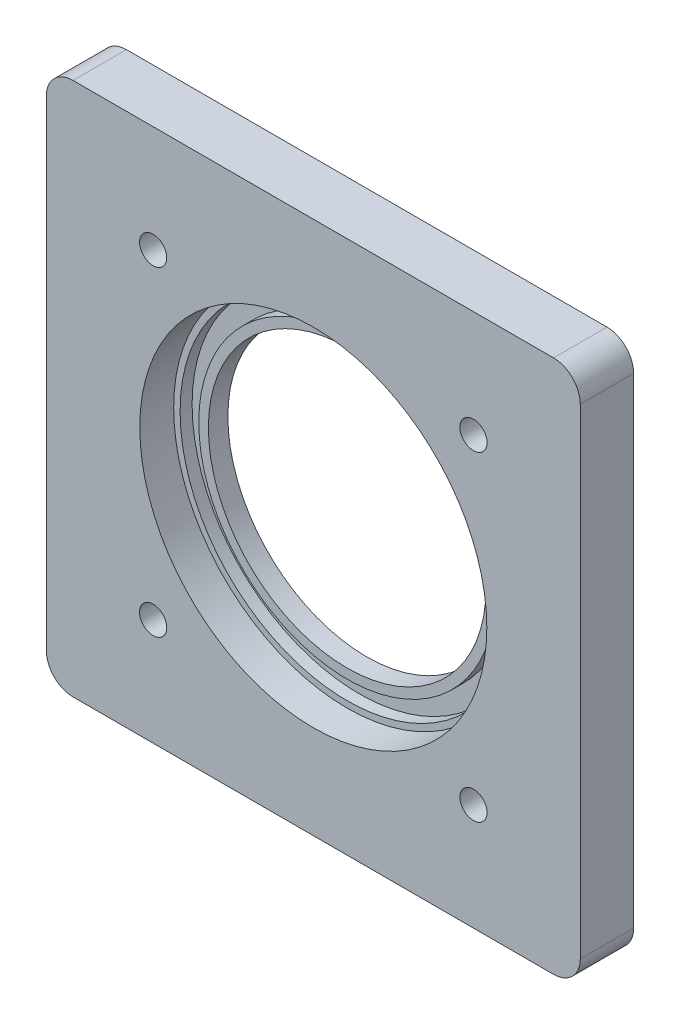
ISO-10303-21;
HEADER;
FILE_DESCRIPTION(('STEP AP214'),'2;1');
FILE_NAME('part.step','',(''),(''),'','','');
FILE_SCHEMA(('AUTOMOTIVE_DESIGN { 1 0 10303 214 1 1 1 1 }'));
ENDSEC;
DATA;
#1=APPLICATION_CONTEXT('core data for automotive mechanical design processes');
#2=APPLICATION_PROTOCOL_DEFINITION('international standard','automotive_design',2000,#1);
#3=PRODUCT_CONTEXT('',#1,'mechanical');
#4=PRODUCT('Part','Part','',(#3));
#5=PRODUCT_RELATED_PRODUCT_CATEGORY('part','',(#4));
#6=PRODUCT_DEFINITION_FORMATION('','',#4);
#7=PRODUCT_DEFINITION_CONTEXT('part definition',#1,'design');
#8=PRODUCT_DEFINITION('design','',#6,#7);
#9=PRODUCT_DEFINITION_SHAPE('','',#8);
#10=(LENGTH_UNIT() NAMED_UNIT(*) SI_UNIT(.MILLI.,.METRE.));
#11=(NAMED_UNIT(*) PLANE_ANGLE_UNIT() SI_UNIT($,.RADIAN.));
#12=(NAMED_UNIT(*) SI_UNIT($,.STERADIAN.) SOLID_ANGLE_UNIT());
#13=UNCERTAINTY_MEASURE_WITH_UNIT(LENGTH_MEASURE(1.E-05),#10,'distance_accuracy_value','');
#14=(GEOMETRIC_REPRESENTATION_CONTEXT(3) GLOBAL_UNCERTAINTY_ASSIGNED_CONTEXT((#13)) GLOBAL_UNIT_ASSIGNED_CONTEXT((#10,
#11,#12)) REPRESENTATION_CONTEXT('',''));
#15=CARTESIAN_POINT('',(0.,0.,0.));
#16=DIRECTION('',(0.,0.,1.));
#17=DIRECTION('',(1.,0.,0.));
#18=AXIS2_PLACEMENT_3D('',#15,#16,#17);
#19=CARTESIAN_POINT('',(50.,50.,1.4));
#20=DIRECTION('',(0.,0.,-1.));
#21=DIRECTION('',(-1.,0.,0.));
#22=AXIS2_PLACEMENT_3D('',#19,#20,#21);
#23=PLANE('',#22);
#24=CARTESIAN_POINT('',(50.,50.,1.4));
#25=DIRECTION('',(0.,0.,-1.));
#26=DIRECTION('',(-1.,0.,0.));
#27=AXIS2_PLACEMENT_3D('',#24,#25,#26);
#28=CIRCLE('',#27,27.8);
#29=CARTESIAN_POINT('',(22.2,50.,1.4));
#30=VERTEX_POINT('',#29);
#31=EDGE_CURVE('E455',#30,#30,#28,.T.);
#32=ORIENTED_EDGE('',*,*,#31,.T.);
#33=EDGE_LOOP('',(#32));
#34=FACE_BOUND('',#33,.T.);
#35=CARTESIAN_POINT('',(50.,50.,1.4));
#36=DIRECTION('',(0.,0.,1.));
#37=DIRECTION('',(1.,0.,0.));
#38=AXIS2_PLACEMENT_3D('',#35,#36,#37);
#39=CIRCLE('',#38,31.3);
#40=CARTESIAN_POINT('',(81.3,50.,1.4));
#41=VERTEX_POINT('',#40);
#42=EDGE_CURVE('E194',#41,#41,#39,.T.);
#43=ORIENTED_EDGE('',*,*,#42,.T.);
#44=EDGE_LOOP('',(#43));
#45=FACE_BOUND('',#44,.T.);
#46=ADVANCED_FACE('F45',(#34,#45),#23,.F.);
#47=CARTESIAN_POINT('',(50.,50.,10.));
#48=DIRECTION('',(0.,0.,1.));
#49=DIRECTION('',(1.,0.,0.));
#50=AXIS2_PLACEMENT_3D('',#47,#48,#49);
#51=CYLINDRICAL_SURFACE('',#50,31.3);
#52=CARTESIAN_POINT('',(50.,50.,3.65));
#53=DIRECTION('',(0.,0.,-1.));
#54=DIRECTION('',(-1.,0.,0.));
#55=AXIS2_PLACEMENT_3D('',#52,#53,#54);
#56=CIRCLE('',#55,31.3);
#57=CARTESIAN_POINT('',(18.7,50.,3.65));
#58=VERTEX_POINT('',#57);
#59=EDGE_CURVE('E462',#58,#58,#56,.T.);
#60=ORIENTED_EDGE('',*,*,#59,.F.);
#61=EDGE_LOOP('',(#60));
#62=FACE_BOUND('',#61,.T.);
#63=ORIENTED_EDGE('',*,*,#42,.F.);
#64=EDGE_LOOP('',(#63));
#65=FACE_BOUND('',#64,.T.);
#66=ADVANCED_FACE('F227',(#62,#65),#51,.F.);
#67=CARTESIAN_POINT('',(50.,50.,3.65));
#68=DIRECTION('',(0.,0.,-1.));
#69=DIRECTION('',(-1.,0.,0.));
#70=AXIS2_PLACEMENT_3D('',#67,#68,#69);
#71=CYLINDRICAL_SURFACE('',#70,27.8);
#72=CARTESIAN_POINT('',(50.,50.,3.65));
#73=DIRECTION('',(0.,0.,-1.));
#74=DIRECTION('',(-1.,0.,0.));
#75=AXIS2_PLACEMENT_3D('',#72,#73,#74);
#76=CIRCLE('',#75,27.8);
#77=CARTESIAN_POINT('',(22.2,50.,3.65));
#78=VERTEX_POINT('',#77);
#79=EDGE_CURVE('E453',#78,#78,#76,.T.);
#80=ORIENTED_EDGE('',*,*,#79,.T.);
#81=EDGE_LOOP('',(#80));
#82=FACE_BOUND('',#81,.T.);
#83=ORIENTED_EDGE('',*,*,#31,.F.);
#84=EDGE_LOOP('',(#83));
#85=FACE_BOUND('',#84,.T.);
#86=ADVANCED_FACE('F234',(#82,#85),#71,.T.);
#87=CARTESIAN_POINT('',(77.8,50.,3.65));
#88=DIRECTION('',(0.,0.,1.));
#89=DIRECTION('',(1.,0.,0.));
#90=AXIS2_PLACEMENT_3D('',#87,#88,#89);
#91=PLANE('',#90);
#92=CARTESIAN_POINT('',(50.,50.,3.65));
#93=DIRECTION('',(0.,0.,1.));
#94=DIRECTION('',(1.,0.,0.));
#95=AXIS2_PLACEMENT_3D('',#92,#93,#94);
#96=CIRCLE('',#95,26.);
#97=CARTESIAN_POINT('',(76.,50.,3.65));
#98=VERTEX_POINT('',#97);
#99=EDGE_CURVE('E508',#98,#98,#96,.T.);
#100=ORIENTED_EDGE('',*,*,#99,.F.);
#101=EDGE_LOOP('',(#100));
#102=FACE_BOUND('',#101,.T.);
#103=ORIENTED_EDGE('',*,*,#79,.F.);
#104=EDGE_LOOP('',(#103));
#105=FACE_BOUND('',#104,.T.);
#106=ADVANCED_FACE('F399',(#102,#105),#91,.T.);
#107=CARTESIAN_POINT('',(50.,50.,10.));
#108=DIRECTION('',(0.,0.,-1.));
#109=DIRECTION('',(-1.,0.,0.));
#110=AXIS2_PLACEMENT_3D('',#107,#108,#109);
#111=CYLINDRICAL_SURFACE('',#110,32.5);
#112=CARTESIAN_POINT('',(50.,50.,10.));
#113=DIRECTION('',(0.,0.,-1.));
#114=DIRECTION('',(-1.,0.,0.));
#115=AXIS2_PLACEMENT_3D('',#112,#113,#114);
#116=CIRCLE('',#115,32.5);
#117=CARTESIAN_POINT('',(17.5,50.,10.));
#118=VERTEX_POINT('',#117);
#119=EDGE_CURVE('E457',#118,#118,#116,.T.);
#120=ORIENTED_EDGE('',*,*,#119,.F.);
#121=EDGE_LOOP('',(#120));
#122=FACE_BOUND('',#121,.T.);
#123=CARTESIAN_POINT('',(50.,50.,3.65));
#124=DIRECTION('',(0.,0.,-1.));
#125=DIRECTION('',(-1.,0.,0.));
#126=AXIS2_PLACEMENT_3D('',#123,#124,#125);
#127=CIRCLE('',#126,32.5);
#128=CARTESIAN_POINT('',(17.5,50.,3.65));
#129=VERTEX_POINT('',#128);
#130=EDGE_CURVE('E468',#129,#129,#127,.T.);
#131=ORIENTED_EDGE('',*,*,#130,.T.);
#132=EDGE_LOOP('',(#131));
#133=FACE_BOUND('',#132,.T.);
#134=ADVANCED_FACE('F389',(#122,#133),#111,.F.);
#135=CARTESIAN_POINT('',(81.3,50.,3.65));
#136=DIRECTION('',(0.,0.,-1.));
#137=DIRECTION('',(-1.,0.,0.));
#138=AXIS2_PLACEMENT_3D('',#135,#136,#137);
#139=PLANE('',#138);
#140=ORIENTED_EDGE('',*,*,#130,.F.);
#141=EDGE_LOOP('',(#140));
#142=FACE_BOUND('',#141,.T.);
#143=ORIENTED_EDGE('',*,*,#59,.T.);
#144=EDGE_LOOP('',(#143));
#145=FACE_BOUND('',#144,.T.);
#146=ADVANCED_FACE('F247',(#142,#145),#139,.F.);
#147=CARTESIAN_POINT('',(0.,0.,0.));
#148=DIRECTION('',(0.,0.,-1.));
#149=DIRECTION('',(-1.,0.,0.));
#150=AXIS2_PLACEMENT_3D('',#147,#148,#149);
#151=PLANE('',#150);
#152=CARTESIAN_POINT('',(50.,50.,0.));
#153=DIRECTION('',(0.,0.,1.));
#154=DIRECTION('',(1.,0.,0.));
#155=AXIS2_PLACEMENT_3D('',#152,#153,#154);
#156=CIRCLE('',#155,26.);
#157=CARTESIAN_POINT('',(76.,50.,0.));
#158=VERTEX_POINT('',#157);
#159=EDGE_CURVE('E504',#158,#158,#156,.T.);
#160=ORIENTED_EDGE('',*,*,#159,.T.);
#161=EDGE_LOOP('',(#160));
#162=FACE_BOUND('',#161,.T.);
#163=DIRECTION('',(-1.,0.,0.));
#164=VECTOR('',#163,1.);
#165=CARTESIAN_POINT('',(100.,0.,0.));
#166=LINE('',#165,#164);
#167=CARTESIAN_POINT('',(95.,0.,0.));
#168=VERTEX_POINT('',#167);
#169=CARTESIAN_POINT('',(5.00000000000005,0.,0.));
#170=VERTEX_POINT('',#169);
#171=EDGE_CURVE('E115',#168,#170,#166,.T.);
#172=ORIENTED_EDGE('',*,*,#171,.T.);
#173=CARTESIAN_POINT('',(5.00000000000002,4.99999999999999,0.));
#174=DIRECTION('',(0.,0.,-1.));
#175=DIRECTION('',(-1.,0.,0.));
#176=AXIS2_PLACEMENT_3D('',#173,#174,#175);
#177=CIRCLE('',#176,5.);
#178=CARTESIAN_POINT('',(0.,4.99999999999999,0.));
#179=VERTEX_POINT('',#178);
#180=EDGE_CURVE('E155',#170,#179,#177,.T.);
#181=ORIENTED_EDGE('',*,*,#180,.T.);
#182=DIRECTION('',(0.,1.,0.));
#183=VECTOR('',#182,1.);
#184=CARTESIAN_POINT('',(0.,0.,0.));
#185=LINE('',#184,#183);
#186=CARTESIAN_POINT('',(0.,95.,0.));
#187=VERTEX_POINT('',#186);
#188=EDGE_CURVE('E134',#179,#187,#185,.T.);
#189=ORIENTED_EDGE('',*,*,#188,.T.);
#190=CARTESIAN_POINT('',(5.00000000000002,95.,0.));
#191=DIRECTION('',(0.,0.,-1.));
#192=DIRECTION('',(-1.,0.,0.));
#193=AXIS2_PLACEMENT_3D('',#190,#191,#192);
#194=CIRCLE('',#193,5.);
#195=CARTESIAN_POINT('',(5.00000000000002,100.,0.));
#196=VERTEX_POINT('',#195);
#197=EDGE_CURVE('E152',#187,#196,#194,.T.);
#198=ORIENTED_EDGE('',*,*,#197,.T.);
#199=DIRECTION('',(1.,0.,0.));
#200=VECTOR('',#199,1.);
#201=CARTESIAN_POINT('',(0.,100.,0.));
#202=LINE('',#201,#200);
#203=CARTESIAN_POINT('',(95.,100.,0.));
#204=VERTEX_POINT('',#203);
#205=EDGE_CURVE('E147',#196,#204,#202,.T.);
#206=ORIENTED_EDGE('',*,*,#205,.T.);
#207=CARTESIAN_POINT('',(95.,95.,0.));
#208=DIRECTION('',(0.,0.,-1.));
#209=DIRECTION('',(-1.,0.,0.));
#210=AXIS2_PLACEMENT_3D('',#207,#208,#209);
#211=CIRCLE('',#210,5.);
#212=CARTESIAN_POINT('',(100.,95.,0.));
#213=VERTEX_POINT('',#212);
#214=EDGE_CURVE('E123',#204,#213,#211,.T.);
#215=ORIENTED_EDGE('',*,*,#214,.T.);
#216=DIRECTION('',(0.,-1.,0.));
#217=VECTOR('',#216,1.);
#218=CARTESIAN_POINT('',(100.,100.,0.));
#219=LINE('',#218,#217);
#220=CARTESIAN_POINT('',(100.,4.99999999999999,0.));
#221=VERTEX_POINT('',#220);
#222=EDGE_CURVE('E117',#213,#221,#219,.T.);
#223=ORIENTED_EDGE('',*,*,#222,.T.);
#224=CARTESIAN_POINT('',(95.,4.99999999999999,0.));
#225=DIRECTION('',(0.,0.,-1.));
#226=DIRECTION('',(-1.,0.,0.));
#227=AXIS2_PLACEMENT_3D('',#224,#225,#226);
#228=CIRCLE('',#227,5.);
#229=EDGE_CURVE('E112',#221,#168,#228,.T.);
#230=ORIENTED_EDGE('',*,*,#229,.T.);
#231=EDGE_LOOP('',(#172,#181,#189,#198,#206,#215,#223,#230));
#232=FACE_BOUND('',#231,.T.);
#233=ADVANCED_FACE('F114',(#162,#232),#151,.T.);
#234=CARTESIAN_POINT('',(100.,0.,10.));
#235=DIRECTION('',(0.,-1.,0.));
#236=DIRECTION('',(1.,0.,0.));
#237=AXIS2_PLACEMENT_3D('',#234,#235,#236);
#238=PLANE('',#237);
#239=DIRECTION('',(-1.,0.,0.));
#240=VECTOR('',#239,1.);
#241=CARTESIAN_POINT('',(100.,0.,10.));
#242=LINE('',#241,#240);
#243=CARTESIAN_POINT('',(95.,0.,10.));
#244=VERTEX_POINT('',#243);
#245=CARTESIAN_POINT('',(5.00000000000005,0.,10.));
#246=VERTEX_POINT('',#245);
#247=EDGE_CURVE('E187',#244,#246,#242,.T.);
#248=ORIENTED_EDGE('',*,*,#247,.T.);
#249=DIRECTION('',(0.,0.,-1.));
#250=VECTOR('',#249,1.);
#251=CARTESIAN_POINT('',(5.00000000000002,0.,10.));
#252=LINE('',#251,#250);
#253=EDGE_CURVE('E124',#246,#170,#252,.T.);
#254=ORIENTED_EDGE('',*,*,#253,.T.);
#255=ORIENTED_EDGE('',*,*,#171,.F.);
#256=DIRECTION('',(0.,0.,-1.));
#257=VECTOR('',#256,1.);
#258=CARTESIAN_POINT('',(95.,0.,10.));
#259=LINE('',#258,#257);
#260=EDGE_CURVE('E130',#168,#244,#259,.F.);
#261=ORIENTED_EDGE('',*,*,#260,.T.);
#262=EDGE_LOOP('',(#248,#254,#255,#261));
#263=FACE_BOUND('',#262,.T.);
#264=ADVANCED_FACE('F129',(#263),#238,.T.);
#265=CARTESIAN_POINT('',(0.,0.,10.));
#266=DIRECTION('',(-1.,0.,0.));
#267=DIRECTION('',(0.,-1.,0.));
#268=AXIS2_PLACEMENT_3D('',#265,#266,#267);
#269=PLANE('',#268);
#270=ORIENTED_EDGE('',*,*,#188,.F.);
#271=DIRECTION('',(0.,0.,-1.));
#272=VECTOR('',#271,1.);
#273=CARTESIAN_POINT('',(0.,4.99999999999999,10.));
#274=LINE('',#273,#272);
#275=CARTESIAN_POINT('',(0.,4.99999999999999,10.));
#276=VERTEX_POINT('',#275);
#277=EDGE_CURVE('E162',#179,#276,#274,.F.);
#278=ORIENTED_EDGE('',*,*,#277,.T.);
#279=DIRECTION('',(0.,1.,0.));
#280=VECTOR('',#279,1.);
#281=CARTESIAN_POINT('',(0.,0.,10.));
#282=LINE('',#281,#280);
#283=CARTESIAN_POINT('',(0.,95.,10.));
#284=VERTEX_POINT('',#283);
#285=EDGE_CURVE('E144',#276,#284,#282,.T.);
#286=ORIENTED_EDGE('',*,*,#285,.T.);
#287=DIRECTION('',(0.,0.,-1.));
#288=VECTOR('',#287,1.);
#289=CARTESIAN_POINT('',(0.,95.,10.));
#290=LINE('',#289,#288);
#291=EDGE_CURVE('E158',#284,#187,#290,.T.);
#292=ORIENTED_EDGE('',*,*,#291,.T.);
#293=EDGE_LOOP('',(#270,#278,#286,#292));
#294=FACE_BOUND('',#293,.T.);
#295=ADVANCED_FACE('F206',(#294),#269,.T.);
#296=CARTESIAN_POINT('',(0.,100.,10.));
#297=DIRECTION('',(0.,1.,0.));
#298=DIRECTION('',(0.,0.,1.));
#299=AXIS2_PLACEMENT_3D('',#296,#297,#298);
#300=PLANE('',#299);
#301=ORIENTED_EDGE('',*,*,#205,.F.);
#302=DIRECTION('',(0.,0.,-1.));
#303=VECTOR('',#302,1.);
#304=CARTESIAN_POINT('',(5.00000000000002,100.,10.));
#305=LINE('',#304,#303);
#306=CARTESIAN_POINT('',(5.00000000000002,100.,10.));
#307=VERTEX_POINT('',#306);
#308=EDGE_CURVE('E68',#196,#307,#305,.F.);
#309=ORIENTED_EDGE('',*,*,#308,.T.);
#310=DIRECTION('',(1.,0.,0.));
#311=VECTOR('',#310,1.);
#312=CARTESIAN_POINT('',(0.,100.,10.));
#313=LINE('',#312,#311);
#314=CARTESIAN_POINT('',(95.,100.,10.));
#315=VERTEX_POINT('',#314);
#316=EDGE_CURVE('E139',#307,#315,#313,.T.);
#317=ORIENTED_EDGE('',*,*,#316,.T.);
#318=DIRECTION('',(0.,0.,-1.));
#319=VECTOR('',#318,1.);
#320=CARTESIAN_POINT('',(95.,100.,10.));
#321=LINE('',#320,#319);
#322=EDGE_CURVE('E175',#315,#204,#321,.T.);
#323=ORIENTED_EDGE('',*,*,#322,.T.);
#324=EDGE_LOOP('',(#301,#309,#317,#323));
#325=FACE_BOUND('',#324,.T.);
#326=ADVANCED_FACE('F249',(#325),#300,.T.);
#327=CARTESIAN_POINT('',(100.,100.,10.));
#328=DIRECTION('',(1.,0.,0.));
#329=DIRECTION('',(0.,0.,-1.));
#330=AXIS2_PLACEMENT_3D('',#327,#328,#329);
#331=PLANE('',#330);
#332=ORIENTED_EDGE('',*,*,#222,.F.);
#333=DIRECTION('',(0.,0.,-1.));
#334=VECTOR('',#333,1.);
#335=CARTESIAN_POINT('',(100.,95.,10.));
#336=LINE('',#335,#334);
#337=CARTESIAN_POINT('',(100.,95.,10.));
#338=VERTEX_POINT('',#337);
#339=EDGE_CURVE('E11',#213,#338,#336,.F.);
#340=ORIENTED_EDGE('',*,*,#339,.T.);
#341=DIRECTION('',(0.,-1.,0.));
#342=VECTOR('',#341,1.);
#343=CARTESIAN_POINT('',(100.,100.,10.));
#344=LINE('',#343,#342);
#345=CARTESIAN_POINT('',(100.,4.99999999999999,10.));
#346=VERTEX_POINT('',#345);
#347=EDGE_CURVE('E185',#338,#346,#344,.T.);
#348=ORIENTED_EDGE('',*,*,#347,.T.);
#349=DIRECTION('',(0.,0.,-1.));
#350=VECTOR('',#349,1.);
#351=CARTESIAN_POINT('',(100.,4.99999999999999,10.));
#352=LINE('',#351,#350);
#353=EDGE_CURVE('E54',#346,#221,#352,.T.);
#354=ORIENTED_EDGE('',*,*,#353,.T.);
#355=EDGE_LOOP('',(#332,#340,#348,#354));
#356=FACE_BOUND('',#355,.T.);
#357=ADVANCED_FACE('F183',(#356),#331,.T.);
#358=CARTESIAN_POINT('',(0.,0.,10.));
#359=DIRECTION('',(0.,0.,-1.));
#360=DIRECTION('',(-1.,0.,0.));
#361=AXIS2_PLACEMENT_3D('',#358,#359,#360);
#362=PLANE('',#361);
#363=CARTESIAN_POINT('',(80.,80.,10.));
#364=DIRECTION('',(0.,0.,1.));
#365=DIRECTION('',(1.,0.,0.));
#366=AXIS2_PLACEMENT_3D('',#363,#364,#365);
#367=CIRCLE('',#366,2.54999999999998);
#368=CARTESIAN_POINT('',(82.55,80.,10.));
#369=VERTEX_POINT('',#368);
#370=EDGE_CURVE('E500',#369,#369,#367,.T.);
#371=ORIENTED_EDGE('',*,*,#370,.F.);
#372=EDGE_LOOP('',(#371));
#373=FACE_BOUND('',#372,.T.);
#374=CARTESIAN_POINT('',(80.,20.,10.));
#375=DIRECTION('',(0.,0.,1.));
#376=DIRECTION('',(1.,0.,0.));
#377=AXIS2_PLACEMENT_3D('',#374,#375,#376);
#378=CIRCLE('',#377,2.54999999999998);
#379=CARTESIAN_POINT('',(82.55,20.,10.));
#380=VERTEX_POINT('',#379);
#381=EDGE_CURVE('E492',#380,#380,#378,.T.);
#382=ORIENTED_EDGE('',*,*,#381,.F.);
#383=EDGE_LOOP('',(#382));
#384=FACE_BOUND('',#383,.T.);
#385=CARTESIAN_POINT('',(20.,20.,10.));
#386=DIRECTION('',(0.,0.,1.));
#387=DIRECTION('',(1.,0.,0.));
#388=AXIS2_PLACEMENT_3D('',#385,#386,#387);
#389=CIRCLE('',#388,2.54999999999999);
#390=CARTESIAN_POINT('',(22.55,20.,10.));
#391=VERTEX_POINT('',#390);
#392=EDGE_CURVE('E484',#391,#391,#389,.T.);
#393=ORIENTED_EDGE('',*,*,#392,.F.);
#394=EDGE_LOOP('',(#393));
#395=FACE_BOUND('',#394,.T.);
#396=CARTESIAN_POINT('',(20.,80.,10.));
#397=DIRECTION('',(0.,0.,1.));
#398=DIRECTION('',(1.,0.,0.));
#399=AXIS2_PLACEMENT_3D('',#396,#397,#398);
#400=CIRCLE('',#399,2.54999999999999);
#401=CARTESIAN_POINT('',(22.55,80.,10.));
#402=VERTEX_POINT('',#401);
#403=EDGE_CURVE('E476',#402,#402,#400,.T.);
#404=ORIENTED_EDGE('',*,*,#403,.F.);
#405=EDGE_LOOP('',(#404));
#406=FACE_BOUND('',#405,.T.);
#407=ORIENTED_EDGE('',*,*,#119,.T.);
#408=EDGE_LOOP('',(#407));
#409=FACE_BOUND('',#408,.T.);
#410=ORIENTED_EDGE('',*,*,#285,.F.);
#411=CARTESIAN_POINT('',(5.00000000000002,4.99999999999999,10.));
#412=DIRECTION('',(0.,0.,-1.));
#413=DIRECTION('',(-1.,0.,0.));
#414=AXIS2_PLACEMENT_3D('',#411,#412,#413);
#415=CIRCLE('',#414,5.);
#416=EDGE_CURVE('E172',#276,#246,#415,.F.);
#417=ORIENTED_EDGE('',*,*,#416,.T.);
#418=ORIENTED_EDGE('',*,*,#247,.F.);
#419=CARTESIAN_POINT('',(95.,4.99999999999999,10.));
#420=DIRECTION('',(0.,0.,-1.));
#421=DIRECTION('',(-1.,0.,0.));
#422=AXIS2_PLACEMENT_3D('',#419,#420,#421);
#423=CIRCLE('',#422,5.);
#424=EDGE_CURVE('E137',#244,#346,#423,.F.);
#425=ORIENTED_EDGE('',*,*,#424,.T.);
#426=ORIENTED_EDGE('',*,*,#347,.F.);
#427=CARTESIAN_POINT('',(95.,95.,10.));
#428=DIRECTION('',(0.,0.,-1.));
#429=DIRECTION('',(-1.,0.,0.));
#430=AXIS2_PLACEMENT_3D('',#427,#428,#429);
#431=CIRCLE('',#430,5.);
#432=EDGE_CURVE('E61',#338,#315,#431,.F.);
#433=ORIENTED_EDGE('',*,*,#432,.T.);
#434=ORIENTED_EDGE('',*,*,#316,.F.);
#435=CARTESIAN_POINT('',(5.00000000000002,95.,10.));
#436=DIRECTION('',(0.,0.,-1.));
#437=DIRECTION('',(-1.,0.,0.));
#438=AXIS2_PLACEMENT_3D('',#435,#436,#437);
#439=CIRCLE('',#438,5.);
#440=EDGE_CURVE('E169',#307,#284,#439,.F.);
#441=ORIENTED_EDGE('',*,*,#440,.T.);
#442=EDGE_LOOP('',(#410,#417,#418,#425,#426,#433,#434,#441));
#443=FACE_BOUND('',#442,.T.);
#444=ADVANCED_FACE('F212',(#373,#384,#395,#406,#409,#443),#362,.F.);
#445=CARTESIAN_POINT('',(20.,80.,4.));
#446=DIRECTION('',(0.,0.,-1.));
#447=DIRECTION('',(-1.,0.,0.));
#448=AXIS2_PLACEMENT_3D('',#445,#446,#447);
#449=PLANE('',#448);
#450=CARTESIAN_POINT('',(20.,80.,3.99999999999999));
#451=DIRECTION('',(0.,0.,1.));
#452=DIRECTION('',(1.,0.,0.));
#453=AXIS2_PLACEMENT_3D('',#450,#451,#452);
#454=CIRCLE('',#453,2.54999999999999);
#455=CARTESIAN_POINT('',(22.55,80.,3.99999999999999));
#456=VERTEX_POINT('',#455);
#457=EDGE_CURVE('E472',#456,#456,#454,.T.);
#458=ORIENTED_EDGE('',*,*,#457,.T.);
#459=EDGE_LOOP('',(#458));
#460=FACE_BOUND('',#459,.T.);
#461=ADVANCED_FACE('F243',(#460),#449,.F.);
#462=CARTESIAN_POINT('',(20.,80.,10.));
#463=DIRECTION('',(0.,0.,1.));
#464=DIRECTION('',(1.,0.,0.));
#465=AXIS2_PLACEMENT_3D('',#462,#463,#464);
#466=CYLINDRICAL_SURFACE('',#465,2.54999999999999);
#467=ORIENTED_EDGE('',*,*,#457,.F.);
#468=EDGE_LOOP('',(#467));
#469=FACE_BOUND('',#468,.T.);
#470=ORIENTED_EDGE('',*,*,#403,.T.);
#471=EDGE_LOOP('',(#470));
#472=FACE_BOUND('',#471,.T.);
#473=ADVANCED_FACE('F361',(#469,#472),#466,.F.);
#474=CARTESIAN_POINT('',(20.,20.,4.));
#475=DIRECTION('',(0.,0.,-1.));
#476=DIRECTION('',(-1.,0.,0.));
#477=AXIS2_PLACEMENT_3D('',#474,#475,#476);
#478=PLANE('',#477);
#479=CARTESIAN_POINT('',(20.,20.,3.99999999999999));
#480=DIRECTION('',(0.,0.,1.));
#481=DIRECTION('',(1.,0.,0.));
#482=AXIS2_PLACEMENT_3D('',#479,#480,#481);
#483=CIRCLE('',#482,2.54999999999999);
#484=CARTESIAN_POINT('',(22.55,20.,3.99999999999999));
#485=VERTEX_POINT('',#484);
#486=EDGE_CURVE('E480',#485,#485,#483,.T.);
#487=ORIENTED_EDGE('',*,*,#486,.T.);
#488=EDGE_LOOP('',(#487));
#489=FACE_BOUND('',#488,.T.);
#490=ADVANCED_FACE('F351',(#489),#478,.F.);
#491=CARTESIAN_POINT('',(20.,20.,10.));
#492=DIRECTION('',(0.,0.,1.));
#493=DIRECTION('',(1.,0.,0.));
#494=AXIS2_PLACEMENT_3D('',#491,#492,#493);
#495=CYLINDRICAL_SURFACE('',#494,2.54999999999999);
#496=ORIENTED_EDGE('',*,*,#486,.F.);
#497=EDGE_LOOP('',(#496));
#498=FACE_BOUND('',#497,.T.);
#499=ORIENTED_EDGE('',*,*,#392,.T.);
#500=EDGE_LOOP('',(#499));
#501=FACE_BOUND('',#500,.T.);
#502=ADVANCED_FACE('F341',(#498,#501),#495,.F.);
#503=CARTESIAN_POINT('',(80.,20.,4.));
#504=DIRECTION('',(0.,0.,-1.));
#505=DIRECTION('',(-1.,0.,0.));
#506=AXIS2_PLACEMENT_3D('',#503,#504,#505);
#507=PLANE('',#506);
#508=CARTESIAN_POINT('',(80.,20.,3.99999999999999));
#509=DIRECTION('',(0.,0.,1.));
#510=DIRECTION('',(1.,0.,0.));
#511=AXIS2_PLACEMENT_3D('',#508,#509,#510);
#512=CIRCLE('',#511,2.54999999999998);
#513=CARTESIAN_POINT('',(82.55,20.,3.99999999999999));
#514=VERTEX_POINT('',#513);
#515=EDGE_CURVE('E488',#514,#514,#512,.T.);
#516=ORIENTED_EDGE('',*,*,#515,.T.);
#517=EDGE_LOOP('',(#516));
#518=FACE_BOUND('',#517,.T.);
#519=ADVANCED_FACE('F331',(#518),#507,.F.);
#520=CARTESIAN_POINT('',(80.,20.,10.));
#521=DIRECTION('',(0.,0.,1.));
#522=DIRECTION('',(1.,0.,0.));
#523=AXIS2_PLACEMENT_3D('',#520,#521,#522);
#524=CYLINDRICAL_SURFACE('',#523,2.54999999999998);
#525=ORIENTED_EDGE('',*,*,#515,.F.);
#526=EDGE_LOOP('',(#525));
#527=FACE_BOUND('',#526,.T.);
#528=ORIENTED_EDGE('',*,*,#381,.T.);
#529=EDGE_LOOP('',(#528));
#530=FACE_BOUND('',#529,.T.);
#531=ADVANCED_FACE('F321',(#527,#530),#524,.F.);
#532=CARTESIAN_POINT('',(80.,80.,4.));
#533=DIRECTION('',(0.,0.,-1.));
#534=DIRECTION('',(-1.,0.,0.));
#535=AXIS2_PLACEMENT_3D('',#532,#533,#534);
#536=PLANE('',#535);
#537=CARTESIAN_POINT('',(80.,80.,3.99999999999999));
#538=DIRECTION('',(0.,0.,1.));
#539=DIRECTION('',(1.,0.,0.));
#540=AXIS2_PLACEMENT_3D('',#537,#538,#539);
#541=CIRCLE('',#540,2.54999999999998);
#542=CARTESIAN_POINT('',(82.55,80.,3.99999999999999));
#543=VERTEX_POINT('',#542);
#544=EDGE_CURVE('E496',#543,#543,#541,.T.);
#545=ORIENTED_EDGE('',*,*,#544,.T.);
#546=EDGE_LOOP('',(#545));
#547=FACE_BOUND('',#546,.T.);
#548=ADVANCED_FACE('F311',(#547),#536,.F.);
#549=CARTESIAN_POINT('',(80.,80.,10.));
#550=DIRECTION('',(0.,0.,1.));
#551=DIRECTION('',(1.,0.,0.));
#552=AXIS2_PLACEMENT_3D('',#549,#550,#551);
#553=CYLINDRICAL_SURFACE('',#552,2.54999999999998);
#554=ORIENTED_EDGE('',*,*,#544,.F.);
#555=EDGE_LOOP('',(#554));
#556=FACE_BOUND('',#555,.T.);
#557=ORIENTED_EDGE('',*,*,#370,.T.);
#558=EDGE_LOOP('',(#557));
#559=FACE_BOUND('',#558,.T.);
#560=ADVANCED_FACE('F300',(#556,#559),#553,.F.);
#561=CARTESIAN_POINT('',(50.,50.,3.65));
#562=DIRECTION('',(0.,0.,1.));
#563=DIRECTION('',(1.,0.,0.));
#564=AXIS2_PLACEMENT_3D('',#561,#562,#563);
#565=CYLINDRICAL_SURFACE('',#564,26.);
#566=ORIENTED_EDGE('',*,*,#159,.F.);
#567=EDGE_LOOP('',(#566));
#568=FACE_BOUND('',#567,.T.);
#569=ORIENTED_EDGE('',*,*,#99,.T.);
#570=EDGE_LOOP('',(#569));
#571=FACE_BOUND('',#570,.T.);
#572=ADVANCED_FACE('F224',(#568,#571),#565,.F.);
#573=CARTESIAN_POINT('',(5.00000000000002,4.99999999999999,10.));
#574=DIRECTION('',(0.,0.,-1.));
#575=DIRECTION('',(-1.,0.,0.));
#576=AXIS2_PLACEMENT_3D('',#573,#574,#575);
#577=CYLINDRICAL_SURFACE('',#576,5.);
#578=ORIENTED_EDGE('',*,*,#416,.F.);
#579=ORIENTED_EDGE('',*,*,#277,.F.);
#580=ORIENTED_EDGE('',*,*,#180,.F.);
#581=ORIENTED_EDGE('',*,*,#253,.F.);
#582=EDGE_LOOP('',(#578,#579,#580,#581));
#583=FACE_BOUND('',#582,.T.);
#584=ADVANCED_FACE('F211',(#583),#577,.T.);
#585=CARTESIAN_POINT('',(5.00000000000002,95.,10.));
#586=DIRECTION('',(0.,0.,-1.));
#587=DIRECTION('',(-1.,0.,0.));
#588=AXIS2_PLACEMENT_3D('',#585,#586,#587);
#589=CYLINDRICAL_SURFACE('',#588,5.);
#590=ORIENTED_EDGE('',*,*,#440,.F.);
#591=ORIENTED_EDGE('',*,*,#308,.F.);
#592=ORIENTED_EDGE('',*,*,#197,.F.);
#593=ORIENTED_EDGE('',*,*,#291,.F.);
#594=EDGE_LOOP('',(#590,#591,#592,#593));
#595=FACE_BOUND('',#594,.T.);
#596=ADVANCED_FACE('F215',(#595),#589,.T.);
#597=CARTESIAN_POINT('',(95.,95.,10.));
#598=DIRECTION('',(0.,0.,-1.));
#599=DIRECTION('',(-1.,0.,0.));
#600=AXIS2_PLACEMENT_3D('',#597,#598,#599);
#601=CYLINDRICAL_SURFACE('',#600,5.);
#602=ORIENTED_EDGE('',*,*,#432,.F.);
#603=ORIENTED_EDGE('',*,*,#339,.F.);
#604=ORIENTED_EDGE('',*,*,#214,.F.);
#605=ORIENTED_EDGE('',*,*,#322,.F.);
#606=EDGE_LOOP('',(#602,#603,#604,#605));
#607=FACE_BOUND('',#606,.T.);
#608=ADVANCED_FACE('F217',(#607),#601,.T.);
#609=CARTESIAN_POINT('',(95.,4.99999999999999,10.));
#610=DIRECTION('',(0.,0.,-1.));
#611=DIRECTION('',(-1.,0.,0.));
#612=AXIS2_PLACEMENT_3D('',#609,#610,#611);
#613=CYLINDRICAL_SURFACE('',#612,5.);
#614=ORIENTED_EDGE('',*,*,#424,.F.);
#615=ORIENTED_EDGE('',*,*,#260,.F.);
#616=ORIENTED_EDGE('',*,*,#229,.F.);
#617=ORIENTED_EDGE('',*,*,#353,.F.);
#618=EDGE_LOOP('',(#614,#615,#616,#617));
#619=FACE_BOUND('',#618,.T.);
#620=ADVANCED_FACE('F47',(#619),#613,.T.);
#621=CLOSED_SHELL('',(#46,#66,#86,#106,#134,#146,#233,#264,#295,#326,#357,#444,#461,#473,#490,
#502,#519,#531,#548,#560,#572,#584,#596,#608,#620));
#622=MANIFOLD_SOLID_BREP('B2',#621);
#623=ADVANCED_BREP_SHAPE_REPRESENTATION('',(#18,#622),#14);
#624=SHAPE_DEFINITION_REPRESENTATION(#9,#623);
ENDSEC;
END-ISO-10303-21;
